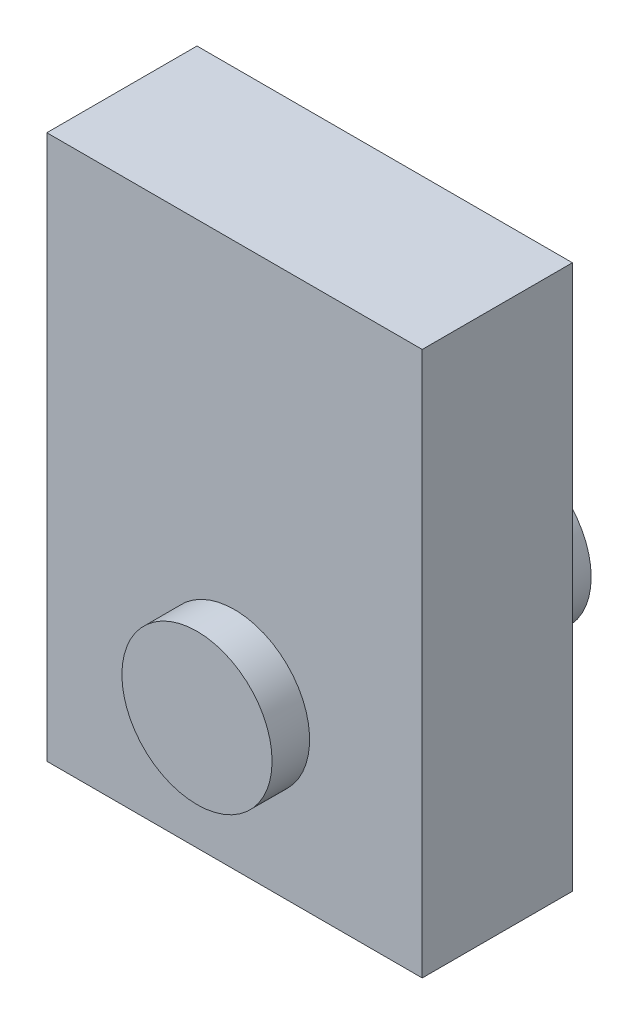
ISO-10303-21;
HEADER;
FILE_DESCRIPTION(('STEP AP214'),'2;1');
FILE_NAME('part.step','',(''),(''),'','','');
FILE_SCHEMA(('AUTOMOTIVE_DESIGN { 1 0 10303 214 1 1 1 1 }'));
ENDSEC;
DATA;
#1=APPLICATION_CONTEXT('core data for automotive mechanical design processes');
#2=APPLICATION_PROTOCOL_DEFINITION('international standard','automotive_design',2000,#1);
#3=PRODUCT_CONTEXT('',#1,'mechanical');
#4=PRODUCT('Part','Part','',(#3));
#5=PRODUCT_RELATED_PRODUCT_CATEGORY('part','',(#4));
#6=PRODUCT_DEFINITION_FORMATION('','',#4);
#7=PRODUCT_DEFINITION_CONTEXT('part definition',#1,'design');
#8=PRODUCT_DEFINITION('design','',#6,#7);
#9=PRODUCT_DEFINITION_SHAPE('','',#8);
#10=(LENGTH_UNIT() NAMED_UNIT(*) SI_UNIT(.MILLI.,.METRE.));
#11=(NAMED_UNIT(*) PLANE_ANGLE_UNIT() SI_UNIT($,.RADIAN.));
#12=(NAMED_UNIT(*) SI_UNIT($,.STERADIAN.) SOLID_ANGLE_UNIT());
#13=UNCERTAINTY_MEASURE_WITH_UNIT(LENGTH_MEASURE(1.E-05),#10,'distance_accuracy_value','');
#14=(GEOMETRIC_REPRESENTATION_CONTEXT(3) GLOBAL_UNCERTAINTY_ASSIGNED_CONTEXT((#13)) GLOBAL_UNIT_ASSIGNED_CONTEXT((#10,
#11,#12)) REPRESENTATION_CONTEXT('',''));
#15=CARTESIAN_POINT('',(0.,0.,0.));
#16=DIRECTION('',(0.,0.,1.));
#17=DIRECTION('',(1.,0.,0.));
#18=AXIS2_PLACEMENT_3D('',#15,#16,#17);
#19=CARTESIAN_POINT('',(-10.,29.,-1.5));
#20=DIRECTION('',(1.,0.,0.));
#21=DIRECTION('',(0.,0.,-1.));
#22=AXIS2_PLACEMENT_3D('',#19,#20,#21);
#23=PLANE('',#22);
#24=DIRECTION('',(0.,0.,1.));
#25=VECTOR('',#24,1.);
#26=CARTESIAN_POINT('',(-10.,0.,-1.5));
#27=LINE('',#26,#25);
#28=CARTESIAN_POINT('',(-10.,0.,-1.5));
#29=VERTEX_POINT('',#28);
#30=CARTESIAN_POINT('',(-10.,0.,6.5));
#31=VERTEX_POINT('',#30);
#32=EDGE_CURVE('E112',#29,#31,#27,.T.);
#33=ORIENTED_EDGE('',*,*,#32,.T.);
#34=DIRECTION('',(0.,-1.,0.));
#35=VECTOR('',#34,1.);
#36=CARTESIAN_POINT('',(-10.,29.,6.5));
#37=LINE('',#36,#35);
#38=CARTESIAN_POINT('',(-10.,29.,6.5));
#39=VERTEX_POINT('',#38);
#40=EDGE_CURVE('E105',#39,#31,#37,.T.);
#41=ORIENTED_EDGE('',*,*,#40,.F.);
#42=DIRECTION('',(0.,0.,1.));
#43=VECTOR('',#42,1.);
#44=CARTESIAN_POINT('',(-10.,29.,-1.5));
#45=LINE('',#44,#43);
#46=CARTESIAN_POINT('',(-10.,29.,-1.5));
#47=VERTEX_POINT('',#46);
#48=EDGE_CURVE('E96',#47,#39,#45,.T.);
#49=ORIENTED_EDGE('',*,*,#48,.F.);
#50=DIRECTION('',(0.,-1.,0.));
#51=VECTOR('',#50,1.);
#52=CARTESIAN_POINT('',(-10.,29.,-1.5));
#53=LINE('',#52,#51);
#54=EDGE_CURVE('E110',#47,#29,#53,.T.);
#55=ORIENTED_EDGE('',*,*,#54,.T.);
#56=EDGE_LOOP('',(#33,#41,#49,#55));
#57=FACE_BOUND('',#56,.T.);
#58=ADVANCED_FACE('F43',(#57),#23,.F.);
#59=CARTESIAN_POINT('',(-10.,29.,6.5));
#60=DIRECTION('',(0.,0.,-1.));
#61=DIRECTION('',(-1.,0.,0.));
#62=AXIS2_PLACEMENT_3D('',#59,#60,#61);
#63=PLANE('',#62);
#64=CARTESIAN_POINT('',(0.,8.,6.5));
#65=DIRECTION('',(0.,0.,-1.));
#66=DIRECTION('',(-1.,0.,0.));
#67=AXIS2_PLACEMENT_3D('',#64,#65,#66);
#68=CIRCLE('',#67,4.);
#69=CARTESIAN_POINT('',(-4.,8.,6.5));
#70=VERTEX_POINT('',#69);
#71=EDGE_CURVE('E11',#70,#70,#68,.F.);
#72=ORIENTED_EDGE('',*,*,#71,.F.);
#73=EDGE_LOOP('',(#72));
#74=FACE_BOUND('',#73,.T.);
#75=DIRECTION('',(1.,0.,0.));
#76=VECTOR('',#75,1.);
#77=CARTESIAN_POINT('',(-10.,0.,6.5));
#78=LINE('',#77,#76);
#79=CARTESIAN_POINT('',(10.,0.,6.5));
#80=VERTEX_POINT('',#79);
#81=EDGE_CURVE('E101',#31,#80,#78,.T.);
#82=ORIENTED_EDGE('',*,*,#81,.T.);
#83=DIRECTION('',(0.,-1.,0.));
#84=VECTOR('',#83,1.);
#85=CARTESIAN_POINT('',(10.,29.,6.5));
#86=LINE('',#85,#84);
#87=CARTESIAN_POINT('',(10.,29.,6.5));
#88=VERTEX_POINT('',#87);
#89=EDGE_CURVE('E97',#88,#80,#86,.T.);
#90=ORIENTED_EDGE('',*,*,#89,.F.);
#91=DIRECTION('',(1.,0.,0.));
#92=VECTOR('',#91,1.);
#93=CARTESIAN_POINT('',(-10.,29.,6.5));
#94=LINE('',#93,#92);
#95=EDGE_CURVE('E93',#39,#88,#94,.T.);
#96=ORIENTED_EDGE('',*,*,#95,.F.);
#97=ORIENTED_EDGE('',*,*,#40,.T.);
#98=EDGE_LOOP('',(#82,#90,#96,#97));
#99=FACE_BOUND('',#98,.T.);
#100=ADVANCED_FACE('F99',(#74,#99),#63,.F.);
#101=CARTESIAN_POINT('',(10.,29.,6.5));
#102=DIRECTION('',(-1.,0.,0.));
#103=DIRECTION('',(0.,0.,1.));
#104=AXIS2_PLACEMENT_3D('',#101,#102,#103);
#105=PLANE('',#104);
#106=DIRECTION('',(0.,0.,-1.));
#107=VECTOR('',#106,1.);
#108=CARTESIAN_POINT('',(10.,0.,6.5));
#109=LINE('',#108,#107);
#110=CARTESIAN_POINT('',(10.,0.,-1.5));
#111=VERTEX_POINT('',#110);
#112=EDGE_CURVE('E80',#80,#111,#109,.T.);
#113=ORIENTED_EDGE('',*,*,#112,.T.);
#114=DIRECTION('',(0.,-1.,0.));
#115=VECTOR('',#114,1.);
#116=CARTESIAN_POINT('',(10.,29.,-1.5));
#117=LINE('',#116,#115);
#118=CARTESIAN_POINT('',(10.,29.,-1.5));
#119=VERTEX_POINT('',#118);
#120=EDGE_CURVE('E103',#119,#111,#117,.T.);
#121=ORIENTED_EDGE('',*,*,#120,.F.);
#122=DIRECTION('',(0.,0.,-1.));
#123=VECTOR('',#122,1.);
#124=CARTESIAN_POINT('',(10.,29.,6.5));
#125=LINE('',#124,#123);
#126=EDGE_CURVE('E94',#88,#119,#125,.T.);
#127=ORIENTED_EDGE('',*,*,#126,.F.);
#128=ORIENTED_EDGE('',*,*,#89,.T.);
#129=EDGE_LOOP('',(#113,#121,#127,#128));
#130=FACE_BOUND('',#129,.T.);
#131=ADVANCED_FACE('F104',(#130),#105,.F.);
#132=CARTESIAN_POINT('',(10.,29.,-1.5));
#133=DIRECTION('',(0.,0.,1.));
#134=DIRECTION('',(1.,0.,0.));
#135=AXIS2_PLACEMENT_3D('',#132,#133,#134);
#136=PLANE('',#135);
#137=CARTESIAN_POINT('',(0.,8.,-1.5));
#138=DIRECTION('',(0.,0.,1.));
#139=DIRECTION('',(1.,0.,0.));
#140=AXIS2_PLACEMENT_3D('',#137,#138,#139);
#141=CIRCLE('',#140,4.);
#142=CARTESIAN_POINT('',(4.,8.,-1.5));
#143=VERTEX_POINT('',#142);
#144=EDGE_CURVE('E46',#143,#143,#141,.F.);
#145=ORIENTED_EDGE('',*,*,#144,.F.);
#146=EDGE_LOOP('',(#145));
#147=FACE_BOUND('',#146,.T.);
#148=DIRECTION('',(-1.,0.,0.));
#149=VECTOR('',#148,1.);
#150=CARTESIAN_POINT('',(10.,0.,-1.5));
#151=LINE('',#150,#149);
#152=EDGE_CURVE('E82',#111,#29,#151,.T.);
#153=ORIENTED_EDGE('',*,*,#152,.T.);
#154=ORIENTED_EDGE('',*,*,#54,.F.);
#155=DIRECTION('',(-1.,0.,0.));
#156=VECTOR('',#155,1.);
#157=CARTESIAN_POINT('',(10.,29.,-1.5));
#158=LINE('',#157,#156);
#159=EDGE_CURVE('E58',#119,#47,#158,.T.);
#160=ORIENTED_EDGE('',*,*,#159,.F.);
#161=ORIENTED_EDGE('',*,*,#120,.T.);
#162=EDGE_LOOP('',(#153,#154,#160,#161));
#163=FACE_BOUND('',#162,.T.);
#164=ADVANCED_FACE('F123',(#147,#163),#136,.F.);
#165=CARTESIAN_POINT('',(0.,29.,0.));
#166=DIRECTION('',(0.,1.,0.));
#167=DIRECTION('',(0.,0.,1.));
#168=AXIS2_PLACEMENT_3D('',#165,#166,#167);
#169=PLANE('',#168);
#170=ORIENTED_EDGE('',*,*,#48,.T.);
#171=ORIENTED_EDGE('',*,*,#95,.T.);
#172=ORIENTED_EDGE('',*,*,#126,.T.);
#173=ORIENTED_EDGE('',*,*,#159,.T.);
#174=EDGE_LOOP('',(#170,#171,#172,#173));
#175=FACE_BOUND('',#174,.T.);
#176=ADVANCED_FACE('F95',(#175),#169,.T.);
#177=CARTESIAN_POINT('',(0.,0.,0.));
#178=DIRECTION('',(0.,1.,0.));
#179=DIRECTION('',(0.,0.,1.));
#180=AXIS2_PLACEMENT_3D('',#177,#178,#179);
#181=PLANE('',#180);
#182=ORIENTED_EDGE('',*,*,#32,.F.);
#183=ORIENTED_EDGE('',*,*,#152,.F.);
#184=ORIENTED_EDGE('',*,*,#112,.F.);
#185=ORIENTED_EDGE('',*,*,#81,.F.);
#186=EDGE_LOOP('',(#182,#183,#184,#185));
#187=FACE_BOUND('',#186,.T.);
#188=ADVANCED_FACE('F132',(#187),#181,.F.);
#189=CARTESIAN_POINT('',(0.,8.,-8.5));
#190=DIRECTION('',(0.,0.,1.));
#191=DIRECTION('',(1.,0.,0.));
#192=AXIS2_PLACEMENT_3D('',#189,#190,#191);
#193=PLANE('',#192);
#194=CARTESIAN_POINT('',(0.,8.,-8.5));
#195=DIRECTION('',(0.,0.,1.));
#196=DIRECTION('',(1.,0.,0.));
#197=AXIS2_PLACEMENT_3D('',#194,#195,#196);
#198=CIRCLE('',#197,4.);
#199=CARTESIAN_POINT('',(4.,8.,-8.5));
#200=VERTEX_POINT('',#199);
#201=EDGE_CURVE('E165',#200,#200,#198,.T.);
#202=ORIENTED_EDGE('',*,*,#201,.F.);
#203=EDGE_LOOP('',(#202));
#204=FACE_BOUND('',#203,.T.);
#205=ADVANCED_FACE('F145',(#204),#193,.F.);
#206=CARTESIAN_POINT('',(0.,8.,8.5));
#207=DIRECTION('',(0.,0.,-1.));
#208=DIRECTION('',(-1.,0.,0.));
#209=AXIS2_PLACEMENT_3D('',#206,#207,#208);
#210=CYLINDRICAL_SURFACE('',#209,4.);
#211=ORIENTED_EDGE('',*,*,#201,.T.);
#212=EDGE_LOOP('',(#211));
#213=FACE_BOUND('',#212,.T.);
#214=ORIENTED_EDGE('',*,*,#144,.T.);
#215=EDGE_LOOP('',(#214));
#216=FACE_BOUND('',#215,.T.);
#217=ADVANCED_FACE('F125',(#213,#216),#210,.T.);
#218=CARTESIAN_POINT('',(0.,8.,8.5));
#219=DIRECTION('',(0.,0.,1.));
#220=DIRECTION('',(1.,0.,0.));
#221=AXIS2_PLACEMENT_3D('',#218,#219,#220);
#222=CIRCLE('',#221,4.);
#223=CARTESIAN_POINT('',(4.,8.,8.5));
#224=VERTEX_POINT('',#223);
#225=EDGE_CURVE('E111',#224,#224,#222,.T.);
#226=ORIENTED_EDGE('',*,*,#225,.F.);
#227=EDGE_LOOP('',(#226));
#228=FACE_BOUND('',#227,.T.);
#229=ORIENTED_EDGE('',*,*,#71,.T.);
#230=EDGE_LOOP('',(#229));
#231=FACE_BOUND('',#230,.T.);
#232=ADVANCED_FACE('F151',(#228,#231),#210,.T.);
#233=CARTESIAN_POINT('',(0.,8.,8.5));
#234=DIRECTION('',(0.,0.,1.));
#235=DIRECTION('',(1.,0.,0.));
#236=AXIS2_PLACEMENT_3D('',#233,#234,#235);
#237=PLANE('',#236);
#238=ORIENTED_EDGE('',*,*,#225,.T.);
#239=EDGE_LOOP('',(#238));
#240=FACE_BOUND('',#239,.T.);
#241=ADVANCED_FACE('F153',(#240),#237,.T.);
#242=CLOSED_SHELL('',(#58,#100,#131,#164,#176,#188,#205,#217,#232,#241));
#243=MANIFOLD_SOLID_BREP('B2',#242);
#244=ADVANCED_BREP_SHAPE_REPRESENTATION('',(#18,#243),#14);
#245=SHAPE_DEFINITION_REPRESENTATION(#9,#244);
ENDSEC;
END-ISO-10303-21;
